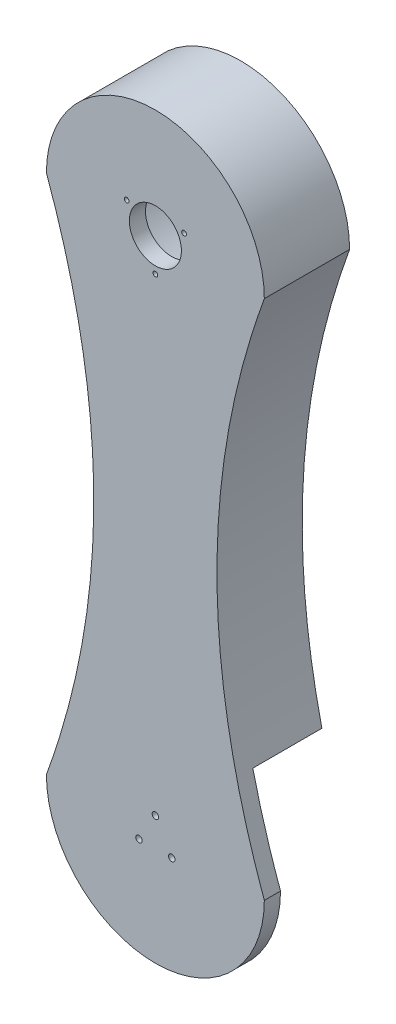
ISO-10303-21;
HEADER;
FILE_DESCRIPTION(('STEP AP214'),'2;1');
FILE_NAME('part.step','',(''),(''),'','','');
FILE_SCHEMA(('AUTOMOTIVE_DESIGN { 1 0 10303 214 1 1 1 1 }'));
ENDSEC;
DATA;
#1=APPLICATION_CONTEXT('core data for automotive mechanical design processes');
#2=APPLICATION_PROTOCOL_DEFINITION('international standard','automotive_design',2000,#1);
#3=PRODUCT_CONTEXT('',#1,'mechanical');
#4=PRODUCT('Part','Part','',(#3));
#5=PRODUCT_RELATED_PRODUCT_CATEGORY('part','',(#4));
#6=PRODUCT_DEFINITION_FORMATION('','',#4);
#7=PRODUCT_DEFINITION_CONTEXT('part definition',#1,'design');
#8=PRODUCT_DEFINITION('design','',#6,#7);
#9=PRODUCT_DEFINITION_SHAPE('','',#8);
#10=(LENGTH_UNIT() NAMED_UNIT(*) SI_UNIT(.MILLI.,.METRE.));
#11=(NAMED_UNIT(*) PLANE_ANGLE_UNIT() SI_UNIT($,.RADIAN.));
#12=(NAMED_UNIT(*) SI_UNIT($,.STERADIAN.) SOLID_ANGLE_UNIT());
#13=UNCERTAINTY_MEASURE_WITH_UNIT(LENGTH_MEASURE(1.E-05),#10,'distance_accuracy_value','');
#14=(GEOMETRIC_REPRESENTATION_CONTEXT(3) GLOBAL_UNCERTAINTY_ASSIGNED_CONTEXT((#13)) GLOBAL_UNIT_ASSIGNED_CONTEXT((#10,
#11,#12)) REPRESENTATION_CONTEXT('',''));
#15=CARTESIAN_POINT('',(0.,0.,0.));
#16=DIRECTION('',(0.,0.,1.));
#17=DIRECTION('',(1.,0.,0.));
#18=AXIS2_PLACEMENT_3D('',#15,#16,#17);
#19=CARTESIAN_POINT('',(0.,0.,90.));
#20=DIRECTION('',(0.,0.,-1.));
#21=DIRECTION('',(-1.,0.,0.));
#22=AXIS2_PLACEMENT_3D('',#19,#20,#21);
#23=CYLINDRICAL_SURFACE('',#22,115.);
#24=CARTESIAN_POINT('',(0.,0.,72.91));
#25=DIRECTION('',(0.,0.,-1.));
#26=DIRECTION('',(-1.,0.,0.));
#27=AXIS2_PLACEMENT_3D('',#24,#25,#26);
#28=CIRCLE('',#27,115.);
#29=CARTESIAN_POINT('',(-115.,0.,72.91));
#30=VERTEX_POINT('',#29);
#31=CARTESIAN_POINT('',(114.999999863721,3.75072417568845E-07,72.91));
#32=VERTEX_POINT('',#31);
#33=EDGE_CURVE('E194',#30,#32,#28,.F.);
#34=ORIENTED_EDGE('',*,*,#33,.T.);
#35=DIRECTION('',(0.,0.,-1.));
#36=VECTOR('',#35,1.);
#37=CARTESIAN_POINT('',(115.,0.,90.));
#38=LINE('',#37,#36);
#39=CARTESIAN_POINT('',(115.,0.,90.));
#40=VERTEX_POINT('',#39);
#41=EDGE_CURVE('E51',#40,#32,#38,.T.);
#42=ORIENTED_EDGE('',*,*,#41,.F.);
#43=CARTESIAN_POINT('',(0.,0.,90.));
#44=DIRECTION('',(0.,0.,1.));
#45=DIRECTION('',(1.,0.,0.));
#46=AXIS2_PLACEMENT_3D('',#43,#44,#45);
#47=CIRCLE('',#46,115.);
#48=CARTESIAN_POINT('',(-115.,0.,90.));
#49=VERTEX_POINT('',#48);
#50=EDGE_CURVE('E90',#49,#40,#47,.T.);
#51=ORIENTED_EDGE('',*,*,#50,.F.);
#52=DIRECTION('',(0.,0.,-1.));
#53=VECTOR('',#52,1.);
#54=CARTESIAN_POINT('',(-115.,0.,90.));
#55=LINE('',#54,#53);
#56=EDGE_CURVE('E11',#49,#30,#55,.T.);
#57=ORIENTED_EDGE('',*,*,#56,.T.);
#58=EDGE_LOOP('',(#34,#42,#51,#57));
#59=FACE_BOUND('',#58,.T.);
#60=ADVANCED_FACE('F39',(#59),#23,.T.);
#61=CARTESIAN_POINT('',(-115.,550.,90.));
#62=CARTESIAN_POINT('',(-15.,275.,90.));
#63=CARTESIAN_POINT('',(-115.,0.,90.));
#64=B_SPLINE_CURVE_WITH_KNOTS('',2,(#61,#62,#63),.UNSPECIFIED.,.F.,.F.,(3,3),(0.,1.),.UNSPECIFIED.);
#65=DIRECTION('',(0.,0.,-1.));
#66=VECTOR('',#65,1.);
#67=SURFACE_OF_LINEAR_EXTRUSION('',#64,#66);
#68=CARTESIAN_POINT('',(-115.,550.,0.));
#69=CARTESIAN_POINT('',(-15.,275.,0.));
#70=CARTESIAN_POINT('',(-115.,0.,0.));
#71=B_SPLINE_CURVE_WITH_KNOTS('',2,(#68,#69,#70),.UNSPECIFIED.,.F.,.F.,(3,3),(0.,1.),.UNSPECIFIED.);
#72=CARTESIAN_POINT('',(-115.,550.,0.));
#73=VERTEX_POINT('',#72);
#74=CARTESIAN_POINT('',(-85.785633536832,97.6915943209165,0.));
#75=VERTEX_POINT('',#74);
#76=EDGE_CURVE('E124',#73,#75,#71,.T.);
#77=ORIENTED_EDGE('',*,*,#76,.T.);
#78=DIRECTION('',(0.,0.,-1.));
#79=VECTOR('',#78,1.);
#80=CARTESIAN_POINT('',(-85.7856335369576,97.6915943208549,400.044320324586));
#81=LINE('',#80,#79);
#82=CARTESIAN_POINT('',(-85.7856335369576,97.6915943208549,72.91));
#83=VERTEX_POINT('',#82);
#84=EDGE_CURVE('E59',#83,#75,#81,.T.);
#85=ORIENTED_EDGE('',*,*,#84,.F.);
#86=CARTESIAN_POINT('',(-1000065.,-38615.8729652601,72.91));
#87=CARTESIAN_POINT('',(999935.,274.999999999999,72.91));
#88=CARTESIAN_POINT('',(-1000065.,39165.8729652601,72.91));
#89=B_SPLINE_CURVE_WITH_KNOTS('',2,(#86,#87,#88),.UNSPECIFIED.,.F.,.F.,(3,3),(0.,1.),.UNSPECIFIED.);
#90=EDGE_CURVE('E162',#83,#30,#89,.F.);
#91=ORIENTED_EDGE('',*,*,#90,.T.);
#92=ORIENTED_EDGE('',*,*,#56,.F.);
#93=CARTESIAN_POINT('',(-115.,550.,90.));
#94=VERTEX_POINT('',#93);
#95=EDGE_CURVE('E126',#94,#49,#64,.T.);
#96=ORIENTED_EDGE('',*,*,#95,.F.);
#97=DIRECTION('',(0.,0.,-1.));
#98=VECTOR('',#97,1.);
#99=CARTESIAN_POINT('',(-115.,550.,90.));
#100=LINE('',#99,#98);
#101=EDGE_CURVE('E146',#94,#73,#100,.T.);
#102=ORIENTED_EDGE('',*,*,#101,.T.);
#103=EDGE_LOOP('',(#77,#85,#91,#92,#96,#102));
#104=FACE_BOUND('',#103,.T.);
#105=ADVANCED_FACE('F41',(#104),#67,.F.);
#106=CARTESIAN_POINT('',(115.,0.,90.));
#107=CARTESIAN_POINT('',(15.,275.,90.));
#108=CARTESIAN_POINT('',(115.,550.,90.));
#109=B_SPLINE_CURVE_WITH_KNOTS('',2,(#106,#107,#108),.UNSPECIFIED.,.F.,.F.,(3,3),(0.,1.),.UNSPECIFIED.);
#110=DIRECTION('',(0.,0.,-1.));
#111=VECTOR('',#110,1.);
#112=SURFACE_OF_LINEAR_EXTRUSION('',#109,#111);
#113=CARTESIAN_POINT('',(1000065.,39165.8729652601,72.91));
#114=CARTESIAN_POINT('',(-999935.,274.999999999999,72.91));
#115=CARTESIAN_POINT('',(1000065.,-38615.8729652601,72.91));
#116=B_SPLINE_CURVE_WITH_KNOTS('',2,(#113,#114,#115),.UNSPECIFIED.,.F.,.F.,(3,3),(0.,1.),.UNSPECIFIED.);
#117=CARTESIAN_POINT('',(85.7856335369571,97.6915943208549,72.91));
#118=VERTEX_POINT('',#117);
#119=EDGE_CURVE('E120',#32,#118,#116,.F.);
#120=ORIENTED_EDGE('',*,*,#119,.T.);
#121=DIRECTION('',(0.,0.,-1.));
#122=VECTOR('',#121,1.);
#123=CARTESIAN_POINT('',(85.7856335369571,97.6915943208549,400.044320324586));
#124=LINE('',#123,#122);
#125=CARTESIAN_POINT('',(85.7856335369571,97.6915943208549,0.));
#126=VERTEX_POINT('',#125);
#127=EDGE_CURVE('E106',#118,#126,#124,.T.);
#128=ORIENTED_EDGE('',*,*,#127,.T.);
#129=CARTESIAN_POINT('',(115.,0.,0.));
#130=CARTESIAN_POINT('',(15.,275.,0.));
#131=CARTESIAN_POINT('',(115.,550.,0.));
#132=B_SPLINE_CURVE_WITH_KNOTS('',2,(#129,#130,#131),.UNSPECIFIED.,.F.,.F.,(3,3),(0.,1.),.UNSPECIFIED.);
#133=CARTESIAN_POINT('',(115.,550.,0.));
#134=VERTEX_POINT('',#133);
#135=EDGE_CURVE('E118',#126,#134,#132,.T.);
#136=ORIENTED_EDGE('',*,*,#135,.T.);
#137=DIRECTION('',(0.,0.,-1.));
#138=VECTOR('',#137,1.);
#139=CARTESIAN_POINT('',(115.,550.,90.));
#140=LINE('',#139,#138);
#141=CARTESIAN_POINT('',(115.,550.,90.));
#142=VERTEX_POINT('',#141);
#143=EDGE_CURVE('E148',#142,#134,#140,.T.);
#144=ORIENTED_EDGE('',*,*,#143,.F.);
#145=EDGE_CURVE('E175',#40,#142,#109,.T.);
#146=ORIENTED_EDGE('',*,*,#145,.F.);
#147=ORIENTED_EDGE('',*,*,#41,.T.);
#148=EDGE_LOOP('',(#120,#128,#136,#144,#146,#147));
#149=FACE_BOUND('',#148,.T.);
#150=ADVANCED_FACE('F116',(#149),#112,.F.);
#151=CARTESIAN_POINT('',(0.,550.,90.));
#152=DIRECTION('',(0.,0.,-1.));
#153=DIRECTION('',(-1.,0.,0.));
#154=AXIS2_PLACEMENT_3D('',#151,#152,#153);
#155=CYLINDRICAL_SURFACE('',#154,115.);
#156=CARTESIAN_POINT('',(0.,550.,0.));
#157=DIRECTION('',(0.,0.,1.));
#158=DIRECTION('',(1.,0.,0.));
#159=AXIS2_PLACEMENT_3D('',#156,#157,#158);
#160=CIRCLE('',#159,115.);
#161=EDGE_CURVE('E83',#134,#73,#160,.T.);
#162=ORIENTED_EDGE('',*,*,#161,.T.);
#163=ORIENTED_EDGE('',*,*,#101,.F.);
#164=CARTESIAN_POINT('',(0.,550.,90.));
#165=DIRECTION('',(0.,0.,1.));
#166=DIRECTION('',(1.,0.,0.));
#167=AXIS2_PLACEMENT_3D('',#164,#165,#166);
#168=CIRCLE('',#167,115.);
#169=EDGE_CURVE('E68',#142,#94,#168,.T.);
#170=ORIENTED_EDGE('',*,*,#169,.F.);
#171=ORIENTED_EDGE('',*,*,#143,.T.);
#172=EDGE_LOOP('',(#162,#163,#170,#171));
#173=FACE_BOUND('',#172,.T.);
#174=ADVANCED_FACE('F185',(#173),#155,.T.);
#175=CARTESIAN_POINT('',(-65.,275.,90.));
#176=DIRECTION('',(0.,0.,-1.));
#177=DIRECTION('',(-1.,0.,0.));
#178=AXIS2_PLACEMENT_3D('',#175,#176,#177);
#179=PLANE('',#178);
#180=CARTESIAN_POINT('',(-30.3108891324553,567.5,90.));
#181=DIRECTION('',(0.,0.,1.));
#182=DIRECTION('',(-0.500000000000004,-0.866025403784436,0.));
#183=AXIS2_PLACEMENT_3D('',#180,#181,#182);
#184=CIRCLE('',#183,2.5);
#185=CARTESIAN_POINT('',(-31.5608891324553,565.334936490539,90.));
#186=VERTEX_POINT('',#185);
#187=EDGE_CURVE('E289',#186,#186,#184,.T.);
#188=ORIENTED_EDGE('',*,*,#187,.F.);
#189=EDGE_LOOP('',(#188));
#190=FACE_BOUND('',#189,.T.);
#191=CARTESIAN_POINT('',(30.3108891324556,567.5,90.));
#192=DIRECTION('',(0.,0.,1.));
#193=DIRECTION('',(-0.499999999999992,0.866025403784443,0.));
#194=AXIS2_PLACEMENT_3D('',#191,#192,#193);
#195=CIRCLE('',#194,2.5);
#196=CARTESIAN_POINT('',(29.0608891324556,569.665063509461,90.));
#197=VERTEX_POINT('',#196);
#198=EDGE_CURVE('E300',#197,#197,#195,.T.);
#199=ORIENTED_EDGE('',*,*,#198,.F.);
#200=EDGE_LOOP('',(#199));
#201=FACE_BOUND('',#200,.T.);
#202=CARTESIAN_POINT('',(0.,515.,90.));
#203=DIRECTION('',(0.,0.,1.));
#204=DIRECTION('',(1.,0.,0.));
#205=AXIS2_PLACEMENT_3D('',#202,#203,#204);
#206=CIRCLE('',#205,2.5);
#207=CARTESIAN_POINT('',(2.5,515.,90.));
#208=VERTEX_POINT('',#207);
#209=EDGE_CURVE('E292',#208,#208,#206,.T.);
#210=ORIENTED_EDGE('',*,*,#209,.F.);
#211=EDGE_LOOP('',(#210));
#212=FACE_BOUND('',#211,.T.);
#213=CARTESIAN_POINT('',(0.,20.,90.));
#214=DIRECTION('',(0.,0.,-1.));
#215=DIRECTION('',(-1.,0.,0.));
#216=AXIS2_PLACEMENT_3D('',#213,#214,#215);
#217=CIRCLE('',#216,3.4);
#218=CARTESIAN_POINT('',(-3.4,20.,90.));
#219=VERTEX_POINT('',#218);
#220=EDGE_CURVE('E112',#219,#219,#217,.F.);
#221=ORIENTED_EDGE('',*,*,#220,.F.);
#222=EDGE_LOOP('',(#221));
#223=FACE_BOUND('',#222,.T.);
#224=CARTESIAN_POINT('',(-17.3205080756889,-9.99999999999983,90.));
#225=DIRECTION('',(0.,0.,-1.));
#226=DIRECTION('',(-1.,0.,0.));
#227=AXIS2_PLACEMENT_3D('',#224,#225,#226);
#228=CIRCLE('',#227,3.4);
#229=CARTESIAN_POINT('',(-20.7205080756889,-9.99999999999983,90.));
#230=VERTEX_POINT('',#229);
#231=EDGE_CURVE('E314',#230,#230,#228,.F.);
#232=ORIENTED_EDGE('',*,*,#231,.F.);
#233=EDGE_LOOP('',(#232));
#234=FACE_BOUND('',#233,.T.);
#235=CARTESIAN_POINT('',(17.3205080756887,-10.0000000000001,90.));
#236=DIRECTION('',(0.,0.,-1.));
#237=DIRECTION('',(-1.,0.,0.));
#238=AXIS2_PLACEMENT_3D('',#235,#236,#237);
#239=CIRCLE('',#238,3.4);
#240=CARTESIAN_POINT('',(13.9205080756887,-10.0000000000001,90.));
#241=VERTEX_POINT('',#240);
#242=EDGE_CURVE('E307',#241,#241,#239,.F.);
#243=ORIENTED_EDGE('',*,*,#242,.F.);
#244=EDGE_LOOP('',(#243));
#245=FACE_BOUND('',#244,.T.);
#246=CARTESIAN_POINT('',(0.,550.,90.));
#247=DIRECTION('',(0.,0.,-1.));
#248=DIRECTION('',(-1.,0.,0.));
#249=AXIS2_PLACEMENT_3D('',#246,#247,#248);
#250=CIRCLE('',#249,27.5);
#251=CARTESIAN_POINT('',(-27.5,550.,90.));
#252=VERTEX_POINT('',#251);
#253=EDGE_CURVE('E149',#252,#252,#250,.T.);
#254=ORIENTED_EDGE('',*,*,#253,.T.);
#255=EDGE_LOOP('',(#254));
#256=FACE_BOUND('',#255,.T.);
#257=ORIENTED_EDGE('',*,*,#95,.T.);
#258=ORIENTED_EDGE('',*,*,#50,.T.);
#259=ORIENTED_EDGE('',*,*,#145,.T.);
#260=ORIENTED_EDGE('',*,*,#169,.T.);
#261=EDGE_LOOP('',(#257,#258,#259,#260));
#262=FACE_BOUND('',#261,.T.);
#263=ADVANCED_FACE('F201',(#190,#201,#212,#223,#234,#245,#256,#262),#179,.F.);
#264=CARTESIAN_POINT('',(-65.,275.,0.));
#265=DIRECTION('',(0.,0.,-1.));
#266=DIRECTION('',(-1.,0.,0.));
#267=AXIS2_PLACEMENT_3D('',#264,#265,#266);
#268=PLANE('',#267);
#269=CARTESIAN_POINT('',(-2.22044604925031E-13,-76.8838557921613,0.));
#270=DIRECTION('',(0.,0.,-1.));
#271=DIRECTION('',(-1.,0.,0.));
#272=AXIS2_PLACEMENT_3D('',#269,#270,#271);
#273=CIRCLE('',#272,194.514170958055);
#274=EDGE_CURVE('E103',#75,#126,#273,.T.);
#275=ORIENTED_EDGE('',*,*,#274,.F.);
#276=ORIENTED_EDGE('',*,*,#76,.F.);
#277=ORIENTED_EDGE('',*,*,#161,.F.);
#278=ORIENTED_EDGE('',*,*,#135,.F.);
#279=EDGE_LOOP('',(#275,#276,#277,#278));
#280=FACE_BOUND('',#279,.T.);
#281=CARTESIAN_POINT('',(0.,550.,0.));
#282=DIRECTION('',(0.,0.,-1.));
#283=DIRECTION('',(-1.,0.,0.));
#284=AXIS2_PLACEMENT_3D('',#281,#282,#283);
#285=CIRCLE('',#284,97.5);
#286=CARTESIAN_POINT('',(-97.5,550.,0.));
#287=VERTEX_POINT('',#286);
#288=EDGE_CURVE('E151',#287,#287,#285,.T.);
#289=ORIENTED_EDGE('',*,*,#288,.F.);
#290=EDGE_LOOP('',(#289));
#291=FACE_BOUND('',#290,.T.);
#292=ADVANCED_FACE('F122',(#280,#291),#268,.T.);
#293=CARTESIAN_POINT('',(0.,550.,72.91));
#294=DIRECTION('',(0.,0.,-1.));
#295=DIRECTION('',(-1.,0.,0.));
#296=AXIS2_PLACEMENT_3D('',#293,#294,#295);
#297=CYLINDRICAL_SURFACE('',#296,97.5);
#298=CARTESIAN_POINT('',(0.,550.,72.91));
#299=DIRECTION('',(0.,0.,-1.));
#300=DIRECTION('',(-1.,0.,0.));
#301=AXIS2_PLACEMENT_3D('',#298,#299,#300);
#302=CIRCLE('',#301,97.5);
#303=CARTESIAN_POINT('',(-97.5,550.,72.91));
#304=VERTEX_POINT('',#303);
#305=EDGE_CURVE('E128',#304,#304,#302,.T.);
#306=ORIENTED_EDGE('',*,*,#305,.F.);
#307=EDGE_LOOP('',(#306));
#308=FACE_BOUND('',#307,.T.);
#309=ORIENTED_EDGE('',*,*,#288,.T.);
#310=EDGE_LOOP('',(#309));
#311=FACE_BOUND('',#310,.T.);
#312=ADVANCED_FACE('F241',(#308,#311),#297,.F.);
#313=CARTESIAN_POINT('',(0.,550.,72.91));
#314=DIRECTION('',(0.,0.,-1.));
#315=DIRECTION('',(-1.,0.,0.));
#316=AXIS2_PLACEMENT_3D('',#313,#314,#315);
#317=PLANE('',#316);
#318=CARTESIAN_POINT('',(-30.3108891324553,567.5,72.91));
#319=DIRECTION('',(0.,0.,-1.));
#320=DIRECTION('',(-1.,0.,0.));
#321=AXIS2_PLACEMENT_3D('',#318,#319,#320);
#322=CIRCLE('',#321,2.5);
#323=CARTESIAN_POINT('',(-32.8108891324553,567.5,72.91));
#324=VERTEX_POINT('',#323);
#325=EDGE_CURVE('E291',#324,#324,#322,.F.);
#326=ORIENTED_EDGE('',*,*,#325,.T.);
#327=EDGE_LOOP('',(#326));
#328=FACE_BOUND('',#327,.T.);
#329=CARTESIAN_POINT('',(30.3108891324556,567.5,72.91));
#330=DIRECTION('',(0.,0.,-1.));
#331=DIRECTION('',(-1.,0.,0.));
#332=AXIS2_PLACEMENT_3D('',#329,#330,#331);
#333=CIRCLE('',#332,2.5);
#334=CARTESIAN_POINT('',(27.8108891324556,567.5,72.91));
#335=VERTEX_POINT('',#334);
#336=EDGE_CURVE('E297',#335,#335,#333,.F.);
#337=ORIENTED_EDGE('',*,*,#336,.T.);
#338=EDGE_LOOP('',(#337));
#339=FACE_BOUND('',#338,.T.);
#340=CARTESIAN_POINT('',(0.,515.,72.91));
#341=DIRECTION('',(0.,0.,-1.));
#342=DIRECTION('',(-1.,0.,0.));
#343=AXIS2_PLACEMENT_3D('',#340,#341,#342);
#344=CIRCLE('',#343,2.5);
#345=CARTESIAN_POINT('',(-2.5,515.,72.91));
#346=VERTEX_POINT('',#345);
#347=EDGE_CURVE('E295',#346,#346,#344,.F.);
#348=ORIENTED_EDGE('',*,*,#347,.T.);
#349=EDGE_LOOP('',(#348));
#350=FACE_BOUND('',#349,.T.);
#351=CARTESIAN_POINT('',(0.,550.,72.91));
#352=DIRECTION('',(0.,0.,-1.));
#353=DIRECTION('',(-1.,0.,0.));
#354=AXIS2_PLACEMENT_3D('',#351,#352,#353);
#355=CIRCLE('',#354,27.5);
#356=CARTESIAN_POINT('',(-27.5,550.,72.91));
#357=VERTEX_POINT('',#356);
#358=EDGE_CURVE('E152',#357,#357,#355,.T.);
#359=ORIENTED_EDGE('',*,*,#358,.F.);
#360=EDGE_LOOP('',(#359));
#361=FACE_BOUND('',#360,.T.);
#362=ORIENTED_EDGE('',*,*,#305,.T.);
#363=EDGE_LOOP('',(#362));
#364=FACE_BOUND('',#363,.T.);
#365=ADVANCED_FACE('F249',(#328,#339,#350,#361,#364),#317,.T.);
#366=CARTESIAN_POINT('',(0.,550.,145.82));
#367=DIRECTION('',(0.,0.,-1.));
#368=DIRECTION('',(-1.,0.,0.));
#369=AXIS2_PLACEMENT_3D('',#366,#367,#368);
#370=CYLINDRICAL_SURFACE('',#369,27.5);
#371=ORIENTED_EDGE('',*,*,#358,.T.);
#372=EDGE_LOOP('',(#371));
#373=FACE_BOUND('',#372,.T.);
#374=ORIENTED_EDGE('',*,*,#253,.F.);
#375=EDGE_LOOP('',(#374));
#376=FACE_BOUND('',#375,.T.);
#377=ADVANCED_FACE('F235',(#373,#376),#370,.F.);
#378=CARTESIAN_POINT('',(-2.22044604925031E-13,-76.8838557921613,400.044320324586));
#379=DIRECTION('',(0.,0.,-1.));
#380=DIRECTION('',(-1.,0.,0.));
#381=AXIS2_PLACEMENT_3D('',#378,#379,#380);
#382=CYLINDRICAL_SURFACE('',#381,194.514170958055);
#383=CARTESIAN_POINT('',(-2.22044604925031E-13,-76.8838557921613,72.91));
#384=DIRECTION('',(0.,0.,-1.));
#385=DIRECTION('',(-1.,0.,0.));
#386=AXIS2_PLACEMENT_3D('',#383,#384,#385);
#387=CIRCLE('',#386,194.514170958055);
#388=EDGE_CURVE('E158',#118,#83,#387,.F.);
#389=ORIENTED_EDGE('',*,*,#388,.T.);
#390=ORIENTED_EDGE('',*,*,#84,.T.);
#391=ORIENTED_EDGE('',*,*,#274,.T.);
#392=ORIENTED_EDGE('',*,*,#127,.F.);
#393=EDGE_LOOP('',(#389,#390,#391,#392));
#394=FACE_BOUND('',#393,.T.);
#395=ADVANCED_FACE('F105',(#394),#382,.F.);
#396=CARTESIAN_POINT('',(0.,0.,72.91));
#397=DIRECTION('',(0.,0.,-1.));
#398=DIRECTION('',(-1.,0.,0.));
#399=AXIS2_PLACEMENT_3D('',#396,#397,#398);
#400=PLANE('',#399);
#401=CARTESIAN_POINT('',(0.,20.,72.91));
#402=DIRECTION('',(0.,0.,-1.));
#403=DIRECTION('',(-1.,0.,0.));
#404=AXIS2_PLACEMENT_3D('',#401,#402,#403);
#405=CIRCLE('',#404,3.4);
#406=CARTESIAN_POINT('',(-3.4,20.,72.91));
#407=VERTEX_POINT('',#406);
#408=EDGE_CURVE('E308',#407,#407,#405,.T.);
#409=ORIENTED_EDGE('',*,*,#408,.F.);
#410=EDGE_LOOP('',(#409));
#411=FACE_BOUND('',#410,.T.);
#412=CARTESIAN_POINT('',(-17.3205080756889,-9.99999999999983,72.91));
#413=DIRECTION('',(0.,0.,-1.));
#414=DIRECTION('',(-1.,0.,0.));
#415=AXIS2_PLACEMENT_3D('',#412,#413,#414);
#416=CIRCLE('',#415,3.4);
#417=CARTESIAN_POINT('',(-20.7205080756889,-9.99999999999983,72.91));
#418=VERTEX_POINT('',#417);
#419=EDGE_CURVE('E311',#418,#418,#416,.T.);
#420=ORIENTED_EDGE('',*,*,#419,.F.);
#421=EDGE_LOOP('',(#420));
#422=FACE_BOUND('',#421,.T.);
#423=CARTESIAN_POINT('',(17.3205080756887,-10.0000000000001,72.91));
#424=DIRECTION('',(0.,0.,-1.));
#425=DIRECTION('',(-1.,0.,0.));
#426=AXIS2_PLACEMENT_3D('',#423,#424,#425);
#427=CIRCLE('',#426,3.4);
#428=CARTESIAN_POINT('',(13.9205080756887,-10.0000000000001,72.91));
#429=VERTEX_POINT('',#428);
#430=EDGE_CURVE('E317',#429,#429,#427,.T.);
#431=ORIENTED_EDGE('',*,*,#430,.F.);
#432=EDGE_LOOP('',(#431));
#433=FACE_BOUND('',#432,.T.);
#434=ORIENTED_EDGE('',*,*,#90,.F.);
#435=ORIENTED_EDGE('',*,*,#388,.F.);
#436=ORIENTED_EDGE('',*,*,#119,.F.);
#437=ORIENTED_EDGE('',*,*,#33,.F.);
#438=EDGE_LOOP('',(#434,#435,#436,#437));
#439=FACE_BOUND('',#438,.T.);
#440=ADVANCED_FACE('F223',(#411,#422,#433,#439),#400,.T.);
#441=CARTESIAN_POINT('',(17.3205080756887,-10.0000000000001,99.616652224137));
#442=DIRECTION('',(0.,0.,-1.));
#443=DIRECTION('',(-1.,0.,0.));
#444=AXIS2_PLACEMENT_3D('',#441,#442,#443);
#445=CYLINDRICAL_SURFACE('',#444,3.4);
#446=ORIENTED_EDGE('',*,*,#242,.T.);
#447=EDGE_LOOP('',(#446));
#448=FACE_BOUND('',#447,.T.);
#449=ORIENTED_EDGE('',*,*,#430,.T.);
#450=EDGE_LOOP('',(#449));
#451=FACE_BOUND('',#450,.T.);
#452=ADVANCED_FACE('F225',(#448,#451),#445,.F.);
#453=CARTESIAN_POINT('',(-17.3205080756889,-9.99999999999983,99.616652224137));
#454=DIRECTION('',(0.,0.,-1.));
#455=DIRECTION('',(-1.,0.,0.));
#456=AXIS2_PLACEMENT_3D('',#453,#454,#455);
#457=CYLINDRICAL_SURFACE('',#456,3.4);
#458=ORIENTED_EDGE('',*,*,#231,.T.);
#459=EDGE_LOOP('',(#458));
#460=FACE_BOUND('',#459,.T.);
#461=ORIENTED_EDGE('',*,*,#419,.T.);
#462=EDGE_LOOP('',(#461));
#463=FACE_BOUND('',#462,.T.);
#464=ADVANCED_FACE('F232',(#460,#463),#457,.F.);
#465=CARTESIAN_POINT('',(0.,20.,99.616652224137));
#466=DIRECTION('',(0.,0.,-1.));
#467=DIRECTION('',(-1.,0.,0.));
#468=AXIS2_PLACEMENT_3D('',#465,#466,#467);
#469=CYLINDRICAL_SURFACE('',#468,3.4);
#470=ORIENTED_EDGE('',*,*,#220,.T.);
#471=EDGE_LOOP('',(#470));
#472=FACE_BOUND('',#471,.T.);
#473=ORIENTED_EDGE('',*,*,#408,.T.);
#474=EDGE_LOOP('',(#473));
#475=FACE_BOUND('',#474,.T.);
#476=ADVANCED_FACE('F269',(#472,#475),#469,.F.);
#477=CARTESIAN_POINT('',(0.,515.,65.8389321881346));
#478=DIRECTION('',(0.,0.,1.));
#479=DIRECTION('',(1.,0.,0.));
#480=AXIS2_PLACEMENT_3D('',#477,#478,#479);
#481=CYLINDRICAL_SURFACE('',#480,2.5);
#482=ORIENTED_EDGE('',*,*,#209,.T.);
#483=EDGE_LOOP('',(#482));
#484=FACE_BOUND('',#483,.T.);
#485=ORIENTED_EDGE('',*,*,#347,.F.);
#486=EDGE_LOOP('',(#485));
#487=FACE_BOUND('',#486,.T.);
#488=ADVANCED_FACE('F273',(#484,#487),#481,.F.);
#489=CARTESIAN_POINT('',(30.3108891324556,567.5,65.8389321881346));
#490=DIRECTION('',(0.,0.,1.));
#491=DIRECTION('',(1.,0.,0.));
#492=AXIS2_PLACEMENT_3D('',#489,#490,#491);
#493=CYLINDRICAL_SURFACE('',#492,2.5);
#494=ORIENTED_EDGE('',*,*,#198,.T.);
#495=EDGE_LOOP('',(#494));
#496=FACE_BOUND('',#495,.T.);
#497=ORIENTED_EDGE('',*,*,#336,.F.);
#498=EDGE_LOOP('',(#497));
#499=FACE_BOUND('',#498,.T.);
#500=ADVANCED_FACE('F277',(#496,#499),#493,.F.);
#501=CARTESIAN_POINT('',(-30.3108891324553,567.5,65.8389321881346));
#502=DIRECTION('',(0.,0.,1.));
#503=DIRECTION('',(1.,0.,0.));
#504=AXIS2_PLACEMENT_3D('',#501,#502,#503);
#505=CYLINDRICAL_SURFACE('',#504,2.5);
#506=ORIENTED_EDGE('',*,*,#187,.T.);
#507=EDGE_LOOP('',(#506));
#508=FACE_BOUND('',#507,.T.);
#509=ORIENTED_EDGE('',*,*,#325,.F.);
#510=EDGE_LOOP('',(#509));
#511=FACE_BOUND('',#510,.T.);
#512=ADVANCED_FACE('F280',(#508,#511),#505,.F.);
#513=CLOSED_SHELL('',(#60,#105,#150,#174,#263,#292,#312,#365,#377,#395,#440,#452,#464,#476,#488,
#500,#512));
#514=MANIFOLD_SOLID_BREP('B2',#513);
#515=ADVANCED_BREP_SHAPE_REPRESENTATION('',(#18,#514),#14);
#516=SHAPE_DEFINITION_REPRESENTATION(#9,#515);
ENDSEC;
END-ISO-10303-21;
